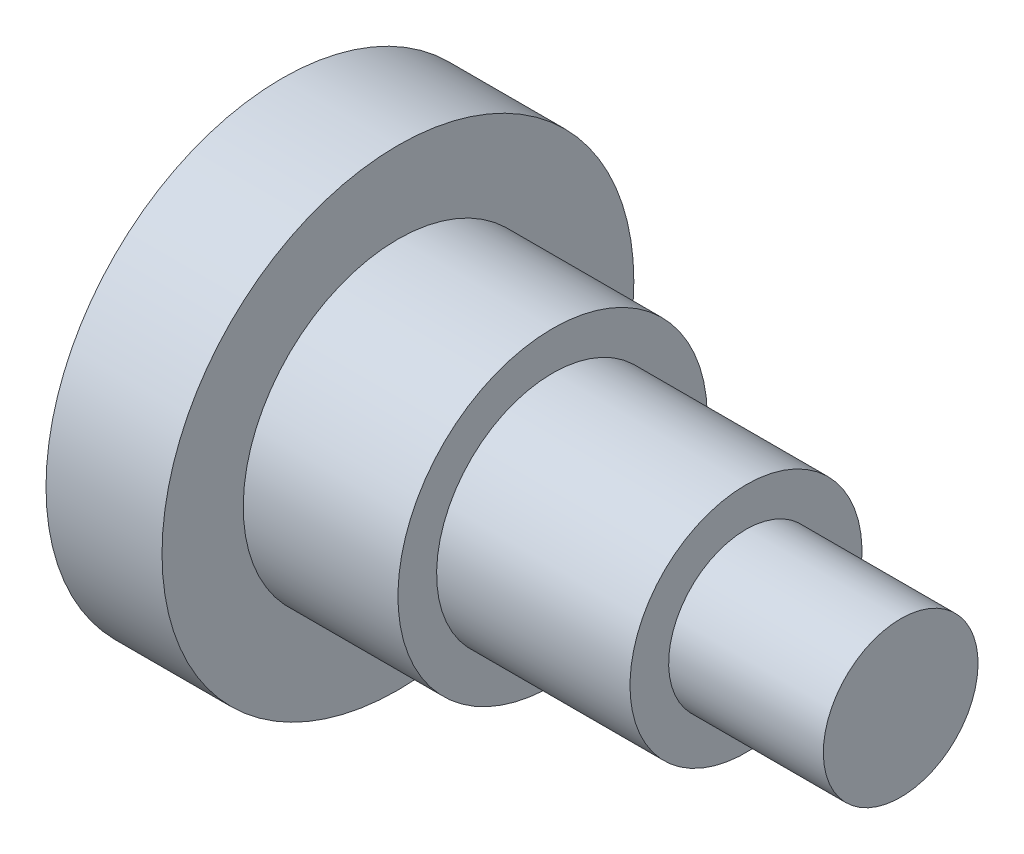
ISO-10303-21;
HEADER;
FILE_DESCRIPTION(('STEP AP214'),'2;1');
FILE_NAME('part.step','',(''),(''),'','','');
FILE_SCHEMA(('AUTOMOTIVE_DESIGN { 1 0 10303 214 1 1 1 1 }'));
ENDSEC;
DATA;
#1=APPLICATION_CONTEXT('core data for automotive mechanical design processes');
#2=APPLICATION_PROTOCOL_DEFINITION('international standard','automotive_design',2000,#1);
#3=PRODUCT_CONTEXT('',#1,'mechanical');
#4=PRODUCT('Part','Part','',(#3));
#5=PRODUCT_RELATED_PRODUCT_CATEGORY('part','',(#4));
#6=PRODUCT_DEFINITION_FORMATION('','',#4);
#7=PRODUCT_DEFINITION_CONTEXT('part definition',#1,'design');
#8=PRODUCT_DEFINITION('design','',#6,#7);
#9=PRODUCT_DEFINITION_SHAPE('','',#8);
#10=(LENGTH_UNIT() NAMED_UNIT(*) SI_UNIT(.MILLI.,.METRE.));
#11=(NAMED_UNIT(*) PLANE_ANGLE_UNIT() SI_UNIT($,.RADIAN.));
#12=(NAMED_UNIT(*) SI_UNIT($,.STERADIAN.) SOLID_ANGLE_UNIT());
#13=UNCERTAINTY_MEASURE_WITH_UNIT(LENGTH_MEASURE(1.E-05),#10,'distance_accuracy_value','');
#14=(GEOMETRIC_REPRESENTATION_CONTEXT(3) GLOBAL_UNCERTAINTY_ASSIGNED_CONTEXT((#13)) GLOBAL_UNIT_ASSIGNED_CONTEXT((#10,
#11,#12)) REPRESENTATION_CONTEXT('',''));
#15=CARTESIAN_POINT('',(0.,0.,0.));
#16=DIRECTION('',(0.,0.,1.));
#17=DIRECTION('',(1.,0.,0.));
#18=AXIS2_PLACEMENT_3D('',#15,#16,#17);
#19=CARTESIAN_POINT('',(0.,0.,0.));
#20=DIRECTION('',(-1.,0.,0.));
#21=DIRECTION('',(0.,-1.,0.));
#22=AXIS2_PLACEMENT_3D('',#19,#20,#21);
#23=PLANE('',#22);
#24=CARTESIAN_POINT('',(0.,0.,0.));
#25=DIRECTION('',(-1.,0.,0.));
#26=DIRECTION('',(0.,-1.,0.));
#27=AXIS2_PLACEMENT_3D('',#24,#25,#26);
#28=CIRCLE('',#27,28.5);
#29=CARTESIAN_POINT('',(0.,-28.5,0.));
#30=VERTEX_POINT('',#29);
#31=EDGE_CURVE('E79',#30,#30,#28,.F.);
#32=ORIENTED_EDGE('',*,*,#31,.T.);
#33=EDGE_LOOP('',(#32));
#34=FACE_BOUND('',#33,.T.);
#35=CARTESIAN_POINT('',(0.,0.,0.));
#36=DIRECTION('',(1.,0.,0.));
#37=DIRECTION('',(0.,1.,0.));
#38=AXIS2_PLACEMENT_3D('',#35,#36,#37);
#39=CIRCLE('',#38,30.5);
#40=CARTESIAN_POINT('',(0.,30.5,0.));
#41=VERTEX_POINT('',#40);
#42=EDGE_CURVE('E10',#41,#41,#39,.T.);
#43=ORIENTED_EDGE('',*,*,#42,.F.);
#44=EDGE_LOOP('',(#43));
#45=FACE_BOUND('',#44,.T.);
#46=ADVANCED_FACE('F40',(#34,#45),#23,.T.);
#47=CARTESIAN_POINT('',(80.,0.,0.));
#48=DIRECTION('',(1.,0.,0.));
#49=DIRECTION('',(0.,1.,0.));
#50=AXIS2_PLACEMENT_3D('',#47,#48,#49);
#51=CYLINDRICAL_SURFACE('',#50,30.5);
#52=ORIENTED_EDGE('',*,*,#42,.T.);
#53=EDGE_LOOP('',(#52));
#54=FACE_BOUND('',#53,.T.);
#55=CARTESIAN_POINT('',(15.,0.,0.));
#56=DIRECTION('',(1.,0.,0.));
#57=DIRECTION('',(0.,1.,0.));
#58=AXIS2_PLACEMENT_3D('',#55,#56,#57);
#59=CIRCLE('',#58,30.5);
#60=CARTESIAN_POINT('',(15.,30.5,0.));
#61=VERTEX_POINT('',#60);
#62=EDGE_CURVE('E47',#61,#61,#59,.T.);
#63=ORIENTED_EDGE('',*,*,#62,.F.);
#64=EDGE_LOOP('',(#63));
#65=FACE_BOUND('',#64,.T.);
#66=ADVANCED_FACE('F157',(#54,#65),#51,.T.);
#67=CARTESIAN_POINT('',(15.,30.5,0.));
#68=DIRECTION('',(1.,0.,0.));
#69=DIRECTION('',(0.,1.,0.));
#70=AXIS2_PLACEMENT_3D('',#67,#68,#69);
#71=PLANE('',#70);
#72=ORIENTED_EDGE('',*,*,#62,.T.);
#73=EDGE_LOOP('',(#72));
#74=FACE_BOUND('',#73,.T.);
#75=CARTESIAN_POINT('',(15.,0.,0.));
#76=DIRECTION('',(1.,0.,0.));
#77=DIRECTION('',(0.,1.,0.));
#78=AXIS2_PLACEMENT_3D('',#75,#76,#77);
#79=CIRCLE('',#78,20.);
#80=CARTESIAN_POINT('',(15.,20.,0.));
#81=VERTEX_POINT('',#80);
#82=EDGE_CURVE('E52',#81,#81,#79,.T.);
#83=ORIENTED_EDGE('',*,*,#82,.F.);
#84=EDGE_LOOP('',(#83));
#85=FACE_BOUND('',#84,.T.);
#86=ADVANCED_FACE('F162',(#74,#85),#71,.T.);
#87=CARTESIAN_POINT('',(80.,0.,0.));
#88=DIRECTION('',(1.,0.,0.));
#89=DIRECTION('',(0.,1.,0.));
#90=AXIS2_PLACEMENT_3D('',#87,#88,#89);
#91=CYLINDRICAL_SURFACE('',#90,20.);
#92=ORIENTED_EDGE('',*,*,#82,.T.);
#93=EDGE_LOOP('',(#92));
#94=FACE_BOUND('',#93,.T.);
#95=CARTESIAN_POINT('',(35.,0.,0.));
#96=DIRECTION('',(1.,0.,0.));
#97=DIRECTION('',(0.,1.,0.));
#98=AXIS2_PLACEMENT_3D('',#95,#96,#97);
#99=CIRCLE('',#98,20.);
#100=CARTESIAN_POINT('',(35.,20.,0.));
#101=VERTEX_POINT('',#100);
#102=EDGE_CURVE('E57',#101,#101,#99,.T.);
#103=ORIENTED_EDGE('',*,*,#102,.F.);
#104=EDGE_LOOP('',(#103));
#105=FACE_BOUND('',#104,.T.);
#106=ADVANCED_FACE('F191',(#94,#105),#91,.T.);
#107=CARTESIAN_POINT('',(35.,20.,0.));
#108=DIRECTION('',(1.,0.,0.));
#109=DIRECTION('',(0.,1.,0.));
#110=AXIS2_PLACEMENT_3D('',#107,#108,#109);
#111=PLANE('',#110);
#112=ORIENTED_EDGE('',*,*,#102,.T.);
#113=EDGE_LOOP('',(#112));
#114=FACE_BOUND('',#113,.T.);
#115=CARTESIAN_POINT('',(35.,0.,0.));
#116=DIRECTION('',(1.,0.,0.));
#117=DIRECTION('',(0.,1.,0.));
#118=AXIS2_PLACEMENT_3D('',#115,#116,#117);
#119=CIRCLE('',#118,15.);
#120=CARTESIAN_POINT('',(35.,15.,0.));
#121=VERTEX_POINT('',#120);
#122=EDGE_CURVE('E63',#121,#121,#119,.T.);
#123=ORIENTED_EDGE('',*,*,#122,.F.);
#124=EDGE_LOOP('',(#123));
#125=FACE_BOUND('',#124,.T.);
#126=ADVANCED_FACE('F187',(#114,#125),#111,.T.);
#127=CARTESIAN_POINT('',(80.,0.,0.));
#128=DIRECTION('',(1.,0.,0.));
#129=DIRECTION('',(0.,1.,0.));
#130=AXIS2_PLACEMENT_3D('',#127,#128,#129);
#131=CYLINDRICAL_SURFACE('',#130,15.);
#132=ORIENTED_EDGE('',*,*,#122,.T.);
#133=EDGE_LOOP('',(#132));
#134=FACE_BOUND('',#133,.T.);
#135=CARTESIAN_POINT('',(60.,0.,0.));
#136=DIRECTION('',(1.,0.,0.));
#137=DIRECTION('',(0.,1.,0.));
#138=AXIS2_PLACEMENT_3D('',#135,#136,#137);
#139=CIRCLE('',#138,15.);
#140=CARTESIAN_POINT('',(60.,15.,0.));
#141=VERTEX_POINT('',#140);
#142=EDGE_CURVE('E67',#141,#141,#139,.T.);
#143=ORIENTED_EDGE('',*,*,#142,.F.);
#144=EDGE_LOOP('',(#143));
#145=FACE_BOUND('',#144,.T.);
#146=ADVANCED_FACE('F183',(#134,#145),#131,.T.);
#147=CARTESIAN_POINT('',(60.,15.,0.));
#148=DIRECTION('',(1.,0.,0.));
#149=DIRECTION('',(0.,1.,0.));
#150=AXIS2_PLACEMENT_3D('',#147,#148,#149);
#151=PLANE('',#150);
#152=ORIENTED_EDGE('',*,*,#142,.T.);
#153=EDGE_LOOP('',(#152));
#154=FACE_BOUND('',#153,.T.);
#155=CARTESIAN_POINT('',(60.,0.,0.));
#156=DIRECTION('',(1.,0.,0.));
#157=DIRECTION('',(0.,1.,0.));
#158=AXIS2_PLACEMENT_3D('',#155,#156,#157);
#159=CIRCLE('',#158,9.99999999999999);
#160=CARTESIAN_POINT('',(60.,9.99999999999999,0.));
#161=VERTEX_POINT('',#160);
#162=EDGE_CURVE('E71',#161,#161,#159,.T.);
#163=ORIENTED_EDGE('',*,*,#162,.F.);
#164=EDGE_LOOP('',(#163));
#165=FACE_BOUND('',#164,.T.);
#166=ADVANCED_FACE('F177',(#154,#165),#151,.T.);
#167=CARTESIAN_POINT('',(80.,0.,0.));
#168=DIRECTION('',(1.,0.,0.));
#169=DIRECTION('',(0.,1.,0.));
#170=AXIS2_PLACEMENT_3D('',#167,#168,#169);
#171=CYLINDRICAL_SURFACE('',#170,9.99999999999999);
#172=ORIENTED_EDGE('',*,*,#162,.T.);
#173=EDGE_LOOP('',(#172));
#174=FACE_BOUND('',#173,.T.);
#175=CARTESIAN_POINT('',(80.,0.,0.));
#176=DIRECTION('',(1.,0.,0.));
#177=DIRECTION('',(0.,1.,0.));
#178=AXIS2_PLACEMENT_3D('',#175,#176,#177);
#179=CIRCLE('',#178,9.99999999999999);
#180=CARTESIAN_POINT('',(80.,10.,0.));
#181=VERTEX_POINT('',#180);
#182=EDGE_CURVE('E75',#181,#181,#179,.T.);
#183=ORIENTED_EDGE('',*,*,#182,.F.);
#184=EDGE_LOOP('',(#183));
#185=FACE_BOUND('',#184,.T.);
#186=ADVANCED_FACE('F172',(#174,#185),#171,.T.);
#187=CARTESIAN_POINT('',(80.,10.,0.));
#188=DIRECTION('',(1.,0.,0.));
#189=DIRECTION('',(0.,1.,0.));
#190=AXIS2_PLACEMENT_3D('',#187,#188,#189);
#191=PLANE('',#190);
#192=ORIENTED_EDGE('',*,*,#182,.T.);
#193=EDGE_LOOP('',(#192));
#194=FACE_BOUND('',#193,.T.);
#195=ADVANCED_FACE('F167',(#194),#191,.T.);
#196=CARTESIAN_POINT('',(80.,0.,0.));
#197=DIRECTION('',(1.,0.,0.));
#198=DIRECTION('',(0.,1.,0.));
#199=AXIS2_PLACEMENT_3D('',#196,#197,#198);
#200=CYLINDRICAL_SURFACE('',#199,28.5);
#201=ORIENTED_EDGE('',*,*,#31,.F.);
#202=EDGE_LOOP('',(#201));
#203=FACE_BOUND('',#202,.T.);
#204=CARTESIAN_POINT('',(13.,0.,0.));
#205=DIRECTION('',(1.,0.,0.));
#206=DIRECTION('',(0.,1.,0.));
#207=AXIS2_PLACEMENT_3D('',#204,#205,#206);
#208=CIRCLE('',#207,28.5);
#209=CARTESIAN_POINT('',(13.,28.5,0.));
#210=VERTEX_POINT('',#209);
#211=EDGE_CURVE('E83',#210,#210,#208,.T.);
#212=ORIENTED_EDGE('',*,*,#211,.T.);
#213=EDGE_LOOP('',(#212));
#214=FACE_BOUND('',#213,.T.);
#215=ADVANCED_FACE('F112',(#203,#214),#200,.F.);
#216=CARTESIAN_POINT('',(13.,30.5,0.));
#217=DIRECTION('',(1.,0.,0.));
#218=DIRECTION('',(0.,1.,0.));
#219=AXIS2_PLACEMENT_3D('',#216,#217,#218);
#220=PLANE('',#219);
#221=ORIENTED_EDGE('',*,*,#211,.F.);
#222=EDGE_LOOP('',(#221));
#223=FACE_BOUND('',#222,.T.);
#224=CARTESIAN_POINT('',(13.,0.,0.));
#225=DIRECTION('',(1.,0.,0.));
#226=DIRECTION('',(0.,1.,0.));
#227=AXIS2_PLACEMENT_3D('',#224,#225,#226);
#228=CIRCLE('',#227,18.);
#229=CARTESIAN_POINT('',(13.,18.,0.));
#230=VERTEX_POINT('',#229);
#231=EDGE_CURVE('E104',#230,#230,#228,.T.);
#232=ORIENTED_EDGE('',*,*,#231,.T.);
#233=EDGE_LOOP('',(#232));
#234=FACE_BOUND('',#233,.T.);
#235=ADVANCED_FACE('F114',(#223,#234),#220,.F.);
#236=CARTESIAN_POINT('',(80.,0.,0.));
#237=DIRECTION('',(1.,0.,0.));
#238=DIRECTION('',(0.,1.,0.));
#239=AXIS2_PLACEMENT_3D('',#236,#237,#238);
#240=CYLINDRICAL_SURFACE('',#239,18.);
#241=ORIENTED_EDGE('',*,*,#231,.F.);
#242=EDGE_LOOP('',(#241));
#243=FACE_BOUND('',#242,.T.);
#244=CARTESIAN_POINT('',(33.,0.,0.));
#245=DIRECTION('',(1.,0.,0.));
#246=DIRECTION('',(0.,1.,0.));
#247=AXIS2_PLACEMENT_3D('',#244,#245,#246);
#248=CIRCLE('',#247,18.);
#249=CARTESIAN_POINT('',(33.,18.,0.));
#250=VERTEX_POINT('',#249);
#251=EDGE_CURVE('E100',#250,#250,#248,.T.);
#252=ORIENTED_EDGE('',*,*,#251,.T.);
#253=EDGE_LOOP('',(#252));
#254=FACE_BOUND('',#253,.T.);
#255=ADVANCED_FACE('F117',(#243,#254),#240,.F.);
#256=CARTESIAN_POINT('',(33.,20.,0.));
#257=DIRECTION('',(1.,0.,0.));
#258=DIRECTION('',(0.,1.,0.));
#259=AXIS2_PLACEMENT_3D('',#256,#257,#258);
#260=PLANE('',#259);
#261=ORIENTED_EDGE('',*,*,#251,.F.);
#262=EDGE_LOOP('',(#261));
#263=FACE_BOUND('',#262,.T.);
#264=CARTESIAN_POINT('',(33.,0.,0.));
#265=DIRECTION('',(1.,0.,0.));
#266=DIRECTION('',(0.,1.,0.));
#267=AXIS2_PLACEMENT_3D('',#264,#265,#266);
#268=CIRCLE('',#267,13.);
#269=CARTESIAN_POINT('',(33.,13.,0.));
#270=VERTEX_POINT('',#269);
#271=EDGE_CURVE('E96',#270,#270,#268,.T.);
#272=ORIENTED_EDGE('',*,*,#271,.T.);
#273=EDGE_LOOP('',(#272));
#274=FACE_BOUND('',#273,.T.);
#275=ADVANCED_FACE('F123',(#263,#274),#260,.F.);
#276=CARTESIAN_POINT('',(80.,0.,0.));
#277=DIRECTION('',(1.,0.,0.));
#278=DIRECTION('',(0.,1.,0.));
#279=AXIS2_PLACEMENT_3D('',#276,#277,#278);
#280=CYLINDRICAL_SURFACE('',#279,13.);
#281=ORIENTED_EDGE('',*,*,#271,.F.);
#282=EDGE_LOOP('',(#281));
#283=FACE_BOUND('',#282,.T.);
#284=CARTESIAN_POINT('',(58.,0.,0.));
#285=DIRECTION('',(1.,0.,0.));
#286=DIRECTION('',(0.,1.,0.));
#287=AXIS2_PLACEMENT_3D('',#284,#285,#286);
#288=CIRCLE('',#287,13.);
#289=CARTESIAN_POINT('',(58.,13.,0.));
#290=VERTEX_POINT('',#289);
#291=EDGE_CURVE('E92',#290,#290,#288,.T.);
#292=ORIENTED_EDGE('',*,*,#291,.T.);
#293=EDGE_LOOP('',(#292));
#294=FACE_BOUND('',#293,.T.);
#295=ADVANCED_FACE('F129',(#283,#294),#280,.F.);
#296=CARTESIAN_POINT('',(58.,15.,0.));
#297=DIRECTION('',(1.,0.,0.));
#298=DIRECTION('',(0.,1.,0.));
#299=AXIS2_PLACEMENT_3D('',#296,#297,#298);
#300=PLANE('',#299);
#301=ORIENTED_EDGE('',*,*,#291,.F.);
#302=EDGE_LOOP('',(#301));
#303=FACE_BOUND('',#302,.T.);
#304=CARTESIAN_POINT('',(58.,0.,0.));
#305=DIRECTION('',(1.,0.,0.));
#306=DIRECTION('',(0.,1.,0.));
#307=AXIS2_PLACEMENT_3D('',#304,#305,#306);
#308=CIRCLE('',#307,7.99999999999999);
#309=CARTESIAN_POINT('',(58.,8.,0.));
#310=VERTEX_POINT('',#309);
#311=EDGE_CURVE('E88',#310,#310,#308,.T.);
#312=ORIENTED_EDGE('',*,*,#311,.T.);
#313=EDGE_LOOP('',(#312));
#314=FACE_BOUND('',#313,.T.);
#315=ADVANCED_FACE('F135',(#303,#314),#300,.F.);
#316=CARTESIAN_POINT('',(80.,0.,0.));
#317=DIRECTION('',(1.,0.,0.));
#318=DIRECTION('',(0.,1.,0.));
#319=AXIS2_PLACEMENT_3D('',#316,#317,#318);
#320=CYLINDRICAL_SURFACE('',#319,7.99999999999999);
#321=ORIENTED_EDGE('',*,*,#311,.F.);
#322=EDGE_LOOP('',(#321));
#323=FACE_BOUND('',#322,.T.);
#324=CARTESIAN_POINT('',(78.,0.,0.));
#325=DIRECTION('',(1.,0.,0.));
#326=DIRECTION('',(0.,1.,0.));
#327=AXIS2_PLACEMENT_3D('',#324,#325,#326);
#328=CIRCLE('',#327,7.99999999999999);
#329=CARTESIAN_POINT('',(78.,8.,0.));
#330=VERTEX_POINT('',#329);
#331=EDGE_CURVE('E84',#330,#330,#328,.T.);
#332=ORIENTED_EDGE('',*,*,#331,.T.);
#333=EDGE_LOOP('',(#332));
#334=FACE_BOUND('',#333,.T.);
#335=ADVANCED_FACE('F141',(#323,#334),#320,.F.);
#336=CARTESIAN_POINT('',(78.,10.,0.));
#337=DIRECTION('',(1.,0.,0.));
#338=DIRECTION('',(0.,1.,0.));
#339=AXIS2_PLACEMENT_3D('',#336,#337,#338);
#340=PLANE('',#339);
#341=ORIENTED_EDGE('',*,*,#331,.F.);
#342=EDGE_LOOP('',(#341));
#343=FACE_BOUND('',#342,.T.);
#344=ADVANCED_FACE('F147',(#343),#340,.F.);
#345=CLOSED_SHELL('',(#46,#66,#86,#106,#126,#146,#166,#186,#195,#215,#235,#255,#275,#295,#315,
#335,#344));
#346=MANIFOLD_SOLID_BREP('B2',#345);
#347=ADVANCED_BREP_SHAPE_REPRESENTATION('',(#18,#346),#14);
#348=SHAPE_DEFINITION_REPRESENTATION(#9,#347);
ENDSEC;
END-ISO-10303-21;
